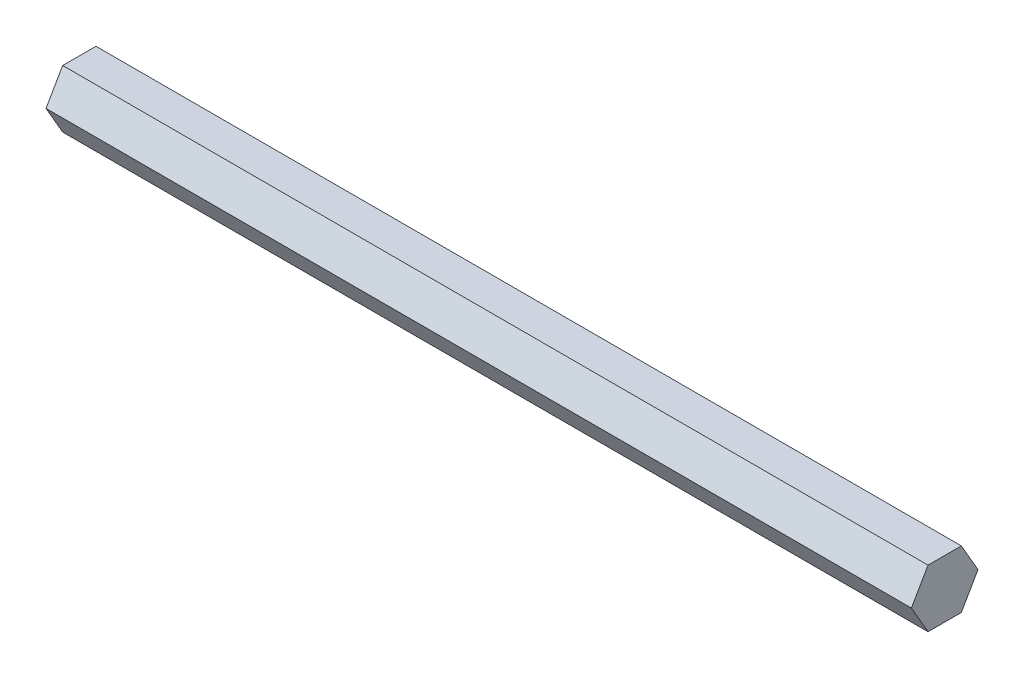
ISO-10303-21;
HEADER;
FILE_DESCRIPTION(('STEP AP214'),'2;1');
FILE_NAME('part.step','',(''),(''),'','','');
FILE_SCHEMA(('AUTOMOTIVE_DESIGN { 1 0 10303 214 1 1 1 1 }'));
ENDSEC;
DATA;
#1=APPLICATION_CONTEXT('core data for automotive mechanical design processes');
#2=APPLICATION_PROTOCOL_DEFINITION('international standard','automotive_design',2000,#1);
#3=PRODUCT_CONTEXT('',#1,'mechanical');
#4=PRODUCT('Part','Part','',(#3));
#5=PRODUCT_RELATED_PRODUCT_CATEGORY('part','',(#4));
#6=PRODUCT_DEFINITION_FORMATION('','',#4);
#7=PRODUCT_DEFINITION_CONTEXT('part definition',#1,'design');
#8=PRODUCT_DEFINITION('design','',#6,#7);
#9=PRODUCT_DEFINITION_SHAPE('','',#8);
#10=(LENGTH_UNIT() NAMED_UNIT(*) SI_UNIT(.MILLI.,.METRE.));
#11=(NAMED_UNIT(*) PLANE_ANGLE_UNIT() SI_UNIT($,.RADIAN.));
#12=(NAMED_UNIT(*) SI_UNIT($,.STERADIAN.) SOLID_ANGLE_UNIT());
#13=UNCERTAINTY_MEASURE_WITH_UNIT(LENGTH_MEASURE(1.E-05),#10,'distance_accuracy_value','');
#14=(GEOMETRIC_REPRESENTATION_CONTEXT(3) GLOBAL_UNCERTAINTY_ASSIGNED_CONTEXT((#13)) GLOBAL_UNIT_ASSIGNED_CONTEXT((#10,
#11,#12)) REPRESENTATION_CONTEXT('',''));
#15=CARTESIAN_POINT('',(0.,0.,0.));
#16=DIRECTION('',(0.,0.,1.));
#17=DIRECTION('',(1.,0.,0.));
#18=AXIS2_PLACEMENT_3D('',#15,#16,#17);
#19=CARTESIAN_POINT('',(190.5,0.,7.33234841870825));
#20=DIRECTION('',(0.,0.5,0.866025403784438));
#21=DIRECTION('',(0.,-0.866025403784438,0.5));
#22=AXIS2_PLACEMENT_3D('',#19,#20,#21);
#23=PLANE('',#22);
#24=DIRECTION('',(0.,0.866025403784438,-0.5));
#25=VECTOR('',#24,1.);
#26=CARTESIAN_POINT('',(0.,0.,7.33234841870825));
#27=LINE('',#26,#25);
#28=CARTESIAN_POINT('',(0.,0.,7.33234841870825));
#29=VERTEX_POINT('',#28);
#30=CARTESIAN_POINT('',(0.,6.35,3.66617420935412));
#31=VERTEX_POINT('',#30);
#32=EDGE_CURVE('E121',#29,#31,#27,.T.);
#33=ORIENTED_EDGE('',*,*,#32,.F.);
#34=DIRECTION('',(-1.,0.,0.));
#35=VECTOR('',#34,1.);
#36=CARTESIAN_POINT('',(190.5,0.,7.33234841870825));
#37=LINE('',#36,#35);
#38=CARTESIAN_POINT('',(190.5,0.,7.33234841870825));
#39=VERTEX_POINT('',#38);
#40=EDGE_CURVE('E11',#39,#29,#37,.T.);
#41=ORIENTED_EDGE('',*,*,#40,.F.);
#42=DIRECTION('',(0.,0.866025403784438,-0.5));
#43=VECTOR('',#42,1.);
#44=CARTESIAN_POINT('',(190.5,0.,7.33234841870825));
#45=LINE('',#44,#43);
#46=CARTESIAN_POINT('',(190.5,6.35,3.66617420935412));
#47=VERTEX_POINT('',#46);
#48=EDGE_CURVE('E140',#39,#47,#45,.T.);
#49=ORIENTED_EDGE('',*,*,#48,.T.);
#50=DIRECTION('',(-1.,0.,0.));
#51=VECTOR('',#50,1.);
#52=CARTESIAN_POINT('',(190.5,6.35,3.66617420935412));
#53=LINE('',#52,#51);
#54=EDGE_CURVE('E45',#47,#31,#53,.T.);
#55=ORIENTED_EDGE('',*,*,#54,.T.);
#56=EDGE_LOOP('',(#33,#41,#49,#55));
#57=FACE_BOUND('',#56,.T.);
#58=ADVANCED_FACE('F39',(#57),#23,.T.);
#59=CARTESIAN_POINT('',(190.5,-6.35,3.66617420935412));
#60=DIRECTION('',(0.,-0.5,0.866025403784439));
#61=DIRECTION('',(0.,-0.866025403784439,-0.5));
#62=AXIS2_PLACEMENT_3D('',#59,#60,#61);
#63=PLANE('',#62);
#64=DIRECTION('',(0.,0.866025403784439,0.5));
#65=VECTOR('',#64,1.);
#66=CARTESIAN_POINT('',(0.,-6.35,3.66617420935412));
#67=LINE('',#66,#65);
#68=CARTESIAN_POINT('',(0.,-6.35,3.66617420935412));
#69=VERTEX_POINT('',#68);
#70=EDGE_CURVE('E137',#69,#29,#67,.T.);
#71=ORIENTED_EDGE('',*,*,#70,.F.);
#72=DIRECTION('',(-1.,0.,0.));
#73=VECTOR('',#72,1.);
#74=CARTESIAN_POINT('',(190.5,-6.35,3.66617420935412));
#75=LINE('',#74,#73);
#76=CARTESIAN_POINT('',(190.5,-6.35,3.66617420935412));
#77=VERTEX_POINT('',#76);
#78=EDGE_CURVE('E48',#77,#69,#75,.T.);
#79=ORIENTED_EDGE('',*,*,#78,.F.);
#80=DIRECTION('',(0.,0.866025403784439,0.5));
#81=VECTOR('',#80,1.);
#82=CARTESIAN_POINT('',(190.5,-6.35,3.66617420935412));
#83=LINE('',#82,#81);
#84=EDGE_CURVE('E111',#77,#39,#83,.T.);
#85=ORIENTED_EDGE('',*,*,#84,.T.);
#86=ORIENTED_EDGE('',*,*,#40,.T.);
#87=EDGE_LOOP('',(#71,#79,#85,#86));
#88=FACE_BOUND('',#87,.T.);
#89=ADVANCED_FACE('F148',(#88),#63,.T.);
#90=CARTESIAN_POINT('',(190.5,-6.35,-3.66617420935413));
#91=DIRECTION('',(0.,-1.,0.));
#92=DIRECTION('',(0.,0.,-1.));
#93=AXIS2_PLACEMENT_3D('',#90,#91,#92);
#94=PLANE('',#93);
#95=DIRECTION('',(0.,0.,1.));
#96=VECTOR('',#95,1.);
#97=CARTESIAN_POINT('',(0.,-6.35,-3.66617420935413));
#98=LINE('',#97,#96);
#99=CARTESIAN_POINT('',(0.,-6.35,-3.66617420935413));
#100=VERTEX_POINT('',#99);
#101=EDGE_CURVE('E101',#100,#69,#98,.T.);
#102=ORIENTED_EDGE('',*,*,#101,.F.);
#103=DIRECTION('',(-1.,0.,0.));
#104=VECTOR('',#103,1.);
#105=CARTESIAN_POINT('',(190.5,-6.35,-3.66617420935413));
#106=LINE('',#105,#104);
#107=CARTESIAN_POINT('',(190.5,-6.35,-3.66617420935413));
#108=VERTEX_POINT('',#107);
#109=EDGE_CURVE('E96',#108,#100,#106,.T.);
#110=ORIENTED_EDGE('',*,*,#109,.F.);
#111=DIRECTION('',(0.,0.,1.));
#112=VECTOR('',#111,1.);
#113=CARTESIAN_POINT('',(190.5,-6.35,-3.66617420935413));
#114=LINE('',#113,#112);
#115=EDGE_CURVE('E97',#108,#77,#114,.T.);
#116=ORIENTED_EDGE('',*,*,#115,.T.);
#117=ORIENTED_EDGE('',*,*,#78,.T.);
#118=EDGE_LOOP('',(#102,#110,#116,#117));
#119=FACE_BOUND('',#118,.T.);
#120=ADVANCED_FACE('F98',(#119),#94,.T.);
#121=CARTESIAN_POINT('',(190.5,0.,-7.33234841870825));
#122=DIRECTION('',(0.,-0.5,-0.866025403784439));
#123=DIRECTION('',(0.,0.866025403784439,-0.5));
#124=AXIS2_PLACEMENT_3D('',#121,#122,#123);
#125=PLANE('',#124);
#126=DIRECTION('',(0.,-0.866025403784439,0.5));
#127=VECTOR('',#126,1.);
#128=CARTESIAN_POINT('',(0.,0.,-7.33234841870825));
#129=LINE('',#128,#127);
#130=CARTESIAN_POINT('',(0.,0.,-7.33234841870825));
#131=VERTEX_POINT('',#130);
#132=EDGE_CURVE('E134',#131,#100,#129,.T.);
#133=ORIENTED_EDGE('',*,*,#132,.F.);
#134=DIRECTION('',(-1.,0.,0.));
#135=VECTOR('',#134,1.);
#136=CARTESIAN_POINT('',(190.5,0.,-7.33234841870825));
#137=LINE('',#136,#135);
#138=CARTESIAN_POINT('',(190.5,0.,-7.33234841870825));
#139=VERTEX_POINT('',#138);
#140=EDGE_CURVE('E106',#139,#131,#137,.T.);
#141=ORIENTED_EDGE('',*,*,#140,.F.);
#142=DIRECTION('',(0.,-0.866025403784439,0.5));
#143=VECTOR('',#142,1.);
#144=CARTESIAN_POINT('',(190.5,0.,-7.33234841870825));
#145=LINE('',#144,#143);
#146=EDGE_CURVE('E115',#139,#108,#145,.T.);
#147=ORIENTED_EDGE('',*,*,#146,.T.);
#148=ORIENTED_EDGE('',*,*,#109,.T.);
#149=EDGE_LOOP('',(#133,#141,#147,#148));
#150=FACE_BOUND('',#149,.T.);
#151=ADVANCED_FACE('F117',(#150),#125,.T.);
#152=CARTESIAN_POINT('',(190.5,6.35,-3.66617420935413));
#153=DIRECTION('',(0.,0.5,-0.866025403784439));
#154=DIRECTION('',(0.,0.866025403784439,0.5));
#155=AXIS2_PLACEMENT_3D('',#152,#153,#154);
#156=PLANE('',#155);
#157=DIRECTION('',(0.,-0.866025403784439,-0.5));
#158=VECTOR('',#157,1.);
#159=CARTESIAN_POINT('',(0.,6.35,-3.66617420935413));
#160=LINE('',#159,#158);
#161=CARTESIAN_POINT('',(0.,6.35,-3.66617420935413));
#162=VERTEX_POINT('',#161);
#163=EDGE_CURVE('E128',#162,#131,#160,.T.);
#164=ORIENTED_EDGE('',*,*,#163,.F.);
#165=DIRECTION('',(-1.,0.,0.));
#166=VECTOR('',#165,1.);
#167=CARTESIAN_POINT('',(190.5,6.35,-3.66617420935413));
#168=LINE('',#167,#166);
#169=CARTESIAN_POINT('',(190.5,6.35,-3.66617420935413));
#170=VERTEX_POINT('',#169);
#171=EDGE_CURVE('E143',#170,#162,#168,.T.);
#172=ORIENTED_EDGE('',*,*,#171,.F.);
#173=DIRECTION('',(0.,-0.866025403784439,-0.5));
#174=VECTOR('',#173,1.);
#175=CARTESIAN_POINT('',(190.5,6.35,-3.66617420935413));
#176=LINE('',#175,#174);
#177=EDGE_CURVE('E120',#170,#139,#176,.T.);
#178=ORIENTED_EDGE('',*,*,#177,.T.);
#179=ORIENTED_EDGE('',*,*,#140,.T.);
#180=EDGE_LOOP('',(#164,#172,#178,#179));
#181=FACE_BOUND('',#180,.T.);
#182=ADVANCED_FACE('F157',(#181),#156,.T.);
#183=CARTESIAN_POINT('',(190.5,6.35,3.66617420935412));
#184=DIRECTION('',(0.,1.,0.));
#185=DIRECTION('',(0.,0.,1.));
#186=AXIS2_PLACEMENT_3D('',#183,#184,#185);
#187=PLANE('',#186);
#188=DIRECTION('',(0.,0.,-1.));
#189=VECTOR('',#188,1.);
#190=CARTESIAN_POINT('',(0.,6.35,3.66617420935412));
#191=LINE('',#190,#189);
#192=EDGE_CURVE('E130',#31,#162,#191,.T.);
#193=ORIENTED_EDGE('',*,*,#192,.F.);
#194=ORIENTED_EDGE('',*,*,#54,.F.);
#195=DIRECTION('',(0.,0.,-1.));
#196=VECTOR('',#195,1.);
#197=CARTESIAN_POINT('',(190.5,6.35,3.66617420935412));
#198=LINE('',#197,#196);
#199=EDGE_CURVE('E116',#47,#170,#198,.T.);
#200=ORIENTED_EDGE('',*,*,#199,.T.);
#201=ORIENTED_EDGE('',*,*,#171,.T.);
#202=EDGE_LOOP('',(#193,#194,#200,#201));
#203=FACE_BOUND('',#202,.T.);
#204=ADVANCED_FACE('F141',(#203),#187,.T.);
#205=CARTESIAN_POINT('',(190.5,0.,0.));
#206=DIRECTION('',(-1.,0.,0.));
#207=DIRECTION('',(0.,0.,1.));
#208=AXIS2_PLACEMENT_3D('',#205,#206,#207);
#209=PLANE('',#208);
#210=ORIENTED_EDGE('',*,*,#48,.F.);
#211=ORIENTED_EDGE('',*,*,#84,.F.);
#212=ORIENTED_EDGE('',*,*,#115,.F.);
#213=ORIENTED_EDGE('',*,*,#146,.F.);
#214=ORIENTED_EDGE('',*,*,#177,.F.);
#215=ORIENTED_EDGE('',*,*,#199,.F.);
#216=EDGE_LOOP('',(#210,#211,#212,#213,#214,#215));
#217=FACE_BOUND('',#216,.T.);
#218=ADVANCED_FACE('F109',(#217),#209,.F.);
#219=CARTESIAN_POINT('',(0.,0.,0.));
#220=DIRECTION('',(-1.,0.,0.));
#221=DIRECTION('',(0.,0.,1.));
#222=AXIS2_PLACEMENT_3D('',#219,#220,#221);
#223=PLANE('',#222);
#224=ORIENTED_EDGE('',*,*,#32,.T.);
#225=ORIENTED_EDGE('',*,*,#192,.T.);
#226=ORIENTED_EDGE('',*,*,#163,.T.);
#227=ORIENTED_EDGE('',*,*,#132,.T.);
#228=ORIENTED_EDGE('',*,*,#101,.T.);
#229=ORIENTED_EDGE('',*,*,#70,.T.);
#230=EDGE_LOOP('',(#224,#225,#226,#227,#228,#229));
#231=FACE_BOUND('',#230,.T.);
#232=ADVANCED_FACE('F144',(#231),#223,.T.);
#233=CLOSED_SHELL('',(#58,#89,#120,#151,#182,#204,#218,#232));
#234=MANIFOLD_SOLID_BREP('B2',#233);
#235=ADVANCED_BREP_SHAPE_REPRESENTATION('',(#18,#234),#14);
#236=SHAPE_DEFINITION_REPRESENTATION(#9,#235);
ENDSEC;
END-ISO-10303-21;
